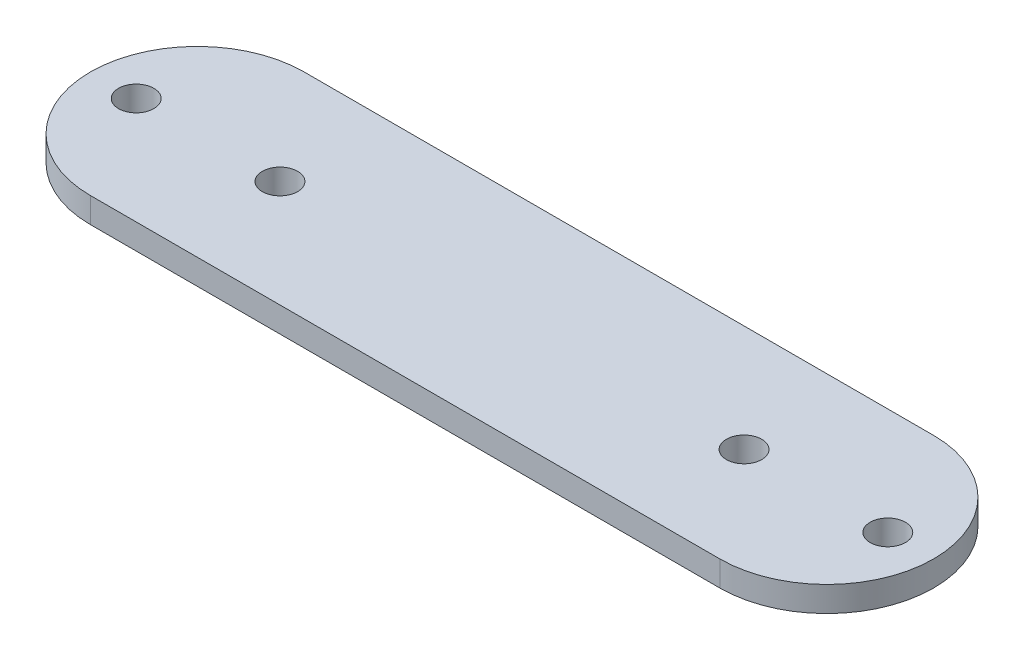
ISO-10303-21;
HEADER;
FILE_DESCRIPTION(('STEP AP214'),'2;1');
FILE_NAME('part.step','',(''),(''),'','','');
FILE_SCHEMA(('AUTOMOTIVE_DESIGN { 1 0 10303 214 1 1 1 1 }'));
ENDSEC;
DATA;
#1=APPLICATION_CONTEXT('core data for automotive mechanical design processes');
#2=APPLICATION_PROTOCOL_DEFINITION('international standard','automotive_design',2000,#1);
#3=PRODUCT_CONTEXT('',#1,'mechanical');
#4=PRODUCT('Part','Part','',(#3));
#5=PRODUCT_RELATED_PRODUCT_CATEGORY('part','',(#4));
#6=PRODUCT_DEFINITION_FORMATION('','',#4);
#7=PRODUCT_DEFINITION_CONTEXT('part definition',#1,'design');
#8=PRODUCT_DEFINITION('design','',#6,#7);
#9=PRODUCT_DEFINITION_SHAPE('','',#8);
#10=(LENGTH_UNIT() NAMED_UNIT(*) SI_UNIT(.MILLI.,.METRE.));
#11=(NAMED_UNIT(*) PLANE_ANGLE_UNIT() SI_UNIT($,.RADIAN.));
#12=(NAMED_UNIT(*) SI_UNIT($,.STERADIAN.) SOLID_ANGLE_UNIT());
#13=UNCERTAINTY_MEASURE_WITH_UNIT(LENGTH_MEASURE(1.E-05),#10,'distance_accuracy_value','');
#14=(GEOMETRIC_REPRESENTATION_CONTEXT(3) GLOBAL_UNCERTAINTY_ASSIGNED_CONTEXT((#13)) GLOBAL_UNIT_ASSIGNED_CONTEXT((#10,
#11,#12)) REPRESENTATION_CONTEXT('',''));
#15=CARTESIAN_POINT('',(0.,0.,0.));
#16=DIRECTION('',(0.,0.,1.));
#17=DIRECTION('',(1.,0.,0.));
#18=AXIS2_PLACEMENT_3D('',#15,#16,#17);
#19=CARTESIAN_POINT('',(-31.2,2.5,0.));
#20=DIRECTION('',(0.,-1.,0.));
#21=DIRECTION('',(0.,0.,-1.));
#22=AXIS2_PLACEMENT_3D('',#19,#20,#21);
#23=CYLINDRICAL_SURFACE('',#22,10.6);
#24=CARTESIAN_POINT('',(-31.2,0.,0.));
#25=DIRECTION('',(0.,1.,0.));
#26=DIRECTION('',(0.,0.,1.));
#27=AXIS2_PLACEMENT_3D('',#24,#25,#26);
#28=CIRCLE('',#27,10.6);
#29=CARTESIAN_POINT('',(-31.2,0.,-10.6));
#30=VERTEX_POINT('',#29);
#31=CARTESIAN_POINT('',(-31.2,0.,10.6));
#32=VERTEX_POINT('',#31);
#33=EDGE_CURVE('E104',#30,#32,#28,.T.);
#34=ORIENTED_EDGE('',*,*,#33,.T.);
#35=DIRECTION('',(0.,-1.,0.));
#36=VECTOR('',#35,1.);
#37=CARTESIAN_POINT('',(-31.2,2.5,10.6));
#38=LINE('',#37,#36);
#39=CARTESIAN_POINT('',(-31.2,2.5,10.6));
#40=VERTEX_POINT('',#39);
#41=EDGE_CURVE('E11',#40,#32,#38,.T.);
#42=ORIENTED_EDGE('',*,*,#41,.F.);
#43=CARTESIAN_POINT('',(-31.2,2.5,0.));
#44=DIRECTION('',(0.,1.,0.));
#45=DIRECTION('',(0.,0.,1.));
#46=AXIS2_PLACEMENT_3D('',#43,#44,#45);
#47=CIRCLE('',#46,10.6);
#48=CARTESIAN_POINT('',(-31.2,2.5,-10.6));
#49=VERTEX_POINT('',#48);
#50=EDGE_CURVE('E92',#49,#40,#47,.T.);
#51=ORIENTED_EDGE('',*,*,#50,.F.);
#52=DIRECTION('',(0.,-1.,0.));
#53=VECTOR('',#52,1.);
#54=CARTESIAN_POINT('',(-31.2,2.5,-10.6));
#55=LINE('',#54,#53);
#56=EDGE_CURVE('E100',#49,#30,#55,.T.);
#57=ORIENTED_EDGE('',*,*,#56,.T.);
#58=EDGE_LOOP('',(#34,#42,#51,#57));
#59=FACE_BOUND('',#58,.T.);
#60=ADVANCED_FACE('F41',(#59),#23,.T.);
#61=CARTESIAN_POINT('',(-31.2,2.5,10.6));
#62=DIRECTION('',(0.,0.,-1.));
#63=DIRECTION('',(-1.,0.,0.));
#64=AXIS2_PLACEMENT_3D('',#61,#62,#63);
#65=PLANE('',#64);
#66=DIRECTION('',(1.,0.,0.));
#67=VECTOR('',#66,1.);
#68=CARTESIAN_POINT('',(-31.2,0.,10.6));
#69=LINE('',#68,#67);
#70=CARTESIAN_POINT('',(31.2,0.,10.6));
#71=VERTEX_POINT('',#70);
#72=EDGE_CURVE('E96',#32,#71,#69,.T.);
#73=ORIENTED_EDGE('',*,*,#72,.T.);
#74=DIRECTION('',(0.,-1.,0.));
#75=VECTOR('',#74,1.);
#76=CARTESIAN_POINT('',(31.2,2.5,10.6));
#77=LINE('',#76,#75);
#78=CARTESIAN_POINT('',(31.2,2.5,10.6));
#79=VERTEX_POINT('',#78);
#80=EDGE_CURVE('E49',#79,#71,#77,.T.);
#81=ORIENTED_EDGE('',*,*,#80,.F.);
#82=DIRECTION('',(1.,0.,0.));
#83=VECTOR('',#82,1.);
#84=CARTESIAN_POINT('',(-31.2,2.5,10.6));
#85=LINE('',#84,#83);
#86=EDGE_CURVE('E87',#40,#79,#85,.T.);
#87=ORIENTED_EDGE('',*,*,#86,.F.);
#88=ORIENTED_EDGE('',*,*,#41,.T.);
#89=EDGE_LOOP('',(#73,#81,#87,#88));
#90=FACE_BOUND('',#89,.T.);
#91=ADVANCED_FACE('F95',(#90),#65,.F.);
#92=CARTESIAN_POINT('',(31.2,2.5,0.));
#93=DIRECTION('',(0.,-1.,0.));
#94=DIRECTION('',(0.,0.,-1.));
#95=AXIS2_PLACEMENT_3D('',#92,#93,#94);
#96=CYLINDRICAL_SURFACE('',#95,10.6);
#97=CARTESIAN_POINT('',(31.2,0.,0.));
#98=DIRECTION('',(0.,1.,0.));
#99=DIRECTION('',(0.,0.,1.));
#100=AXIS2_PLACEMENT_3D('',#97,#98,#99);
#101=CIRCLE('',#100,10.6);
#102=CARTESIAN_POINT('',(31.2,0.,-10.6));
#103=VERTEX_POINT('',#102);
#104=EDGE_CURVE('E74',#71,#103,#101,.T.);
#105=ORIENTED_EDGE('',*,*,#104,.T.);
#106=DIRECTION('',(0.,-1.,0.));
#107=VECTOR('',#106,1.);
#108=CARTESIAN_POINT('',(31.2,2.5,-10.6));
#109=LINE('',#108,#107);
#110=CARTESIAN_POINT('',(31.2,2.5,-10.6));
#111=VERTEX_POINT('',#110);
#112=EDGE_CURVE('E97',#111,#103,#109,.T.);
#113=ORIENTED_EDGE('',*,*,#112,.F.);
#114=CARTESIAN_POINT('',(31.2,2.5,0.));
#115=DIRECTION('',(0.,1.,0.));
#116=DIRECTION('',(0.,0.,1.));
#117=AXIS2_PLACEMENT_3D('',#114,#115,#116);
#118=CIRCLE('',#117,10.6);
#119=EDGE_CURVE('E90',#79,#111,#118,.T.);
#120=ORIENTED_EDGE('',*,*,#119,.F.);
#121=ORIENTED_EDGE('',*,*,#80,.T.);
#122=EDGE_LOOP('',(#105,#113,#120,#121));
#123=FACE_BOUND('',#122,.T.);
#124=ADVANCED_FACE('F98',(#123),#96,.T.);
#125=CARTESIAN_POINT('',(-31.2,2.5,-10.6));
#126=DIRECTION('',(0.,0.,1.));
#127=DIRECTION('',(1.,0.,0.));
#128=AXIS2_PLACEMENT_3D('',#125,#126,#127);
#129=PLANE('',#128);
#130=DIRECTION('',(-1.,0.,0.));
#131=VECTOR('',#130,1.);
#132=CARTESIAN_POINT('',(-31.2,0.,-10.6));
#133=LINE('',#132,#131);
#134=EDGE_CURVE('E80',#103,#30,#133,.T.);
#135=ORIENTED_EDGE('',*,*,#134,.T.);
#136=ORIENTED_EDGE('',*,*,#56,.F.);
#137=DIRECTION('',(-1.,0.,0.));
#138=VECTOR('',#137,1.);
#139=CARTESIAN_POINT('',(-31.2,2.5,-10.6));
#140=LINE('',#139,#138);
#141=EDGE_CURVE('E57',#111,#49,#140,.T.);
#142=ORIENTED_EDGE('',*,*,#141,.F.);
#143=ORIENTED_EDGE('',*,*,#112,.T.);
#144=EDGE_LOOP('',(#135,#136,#142,#143));
#145=FACE_BOUND('',#144,.T.);
#146=ADVANCED_FACE('F112',(#145),#129,.F.);
#147=CARTESIAN_POINT('',(-31.2,2.5,0.));
#148=DIRECTION('',(0.,1.,0.));
#149=DIRECTION('',(0.,0.,1.));
#150=AXIS2_PLACEMENT_3D('',#147,#148,#149);
#151=PLANE('',#150);
#152=CARTESIAN_POINT('',(-37.25,2.5,0.));
#153=DIRECTION('',(0.,1.,0.));
#154=DIRECTION('',(0.,0.,1.));
#155=AXIS2_PLACEMENT_3D('',#152,#153,#154);
#156=CIRCLE('',#155,1.75);
#157=CARTESIAN_POINT('',(-37.25,2.5,1.75));
#158=VERTEX_POINT('',#157);
#159=EDGE_CURVE('E136',#158,#158,#156,.T.);
#160=ORIENTED_EDGE('',*,*,#159,.F.);
#161=EDGE_LOOP('',(#160));
#162=FACE_BOUND('',#161,.T.);
#163=CARTESIAN_POINT('',(-23.,2.5,0.));
#164=DIRECTION('',(0.,1.,0.));
#165=DIRECTION('',(0.,0.,1.));
#166=AXIS2_PLACEMENT_3D('',#163,#164,#165);
#167=CIRCLE('',#166,1.75);
#168=CARTESIAN_POINT('',(-23.,2.5,1.75));
#169=VERTEX_POINT('',#168);
#170=EDGE_CURVE('E133',#169,#169,#167,.T.);
#171=ORIENTED_EDGE('',*,*,#170,.F.);
#172=EDGE_LOOP('',(#171));
#173=FACE_BOUND('',#172,.T.);
#174=CARTESIAN_POINT('',(23.,2.5,0.));
#175=DIRECTION('',(0.,1.,0.));
#176=DIRECTION('',(0.,0.,1.));
#177=AXIS2_PLACEMENT_3D('',#174,#175,#176);
#178=CIRCLE('',#177,1.75);
#179=CARTESIAN_POINT('',(23.,2.5,1.75));
#180=VERTEX_POINT('',#179);
#181=EDGE_CURVE('E127',#180,#180,#178,.T.);
#182=ORIENTED_EDGE('',*,*,#181,.F.);
#183=EDGE_LOOP('',(#182));
#184=FACE_BOUND('',#183,.T.);
#185=CARTESIAN_POINT('',(37.25,2.5,0.));
#186=DIRECTION('',(0.,1.,0.));
#187=DIRECTION('',(0.,0.,1.));
#188=AXIS2_PLACEMENT_3D('',#185,#186,#187);
#189=CIRCLE('',#188,1.75);
#190=CARTESIAN_POINT('',(37.25,2.5,1.75));
#191=VERTEX_POINT('',#190);
#192=EDGE_CURVE('E121',#191,#191,#189,.T.);
#193=ORIENTED_EDGE('',*,*,#192,.F.);
#194=EDGE_LOOP('',(#193));
#195=FACE_BOUND('',#194,.T.);
#196=ORIENTED_EDGE('',*,*,#50,.T.);
#197=ORIENTED_EDGE('',*,*,#86,.T.);
#198=ORIENTED_EDGE('',*,*,#119,.T.);
#199=ORIENTED_EDGE('',*,*,#141,.T.);
#200=EDGE_LOOP('',(#196,#197,#198,#199));
#201=FACE_BOUND('',#200,.T.);
#202=ADVANCED_FACE('F88',(#162,#173,#184,#195,#201),#151,.T.);
#203=CARTESIAN_POINT('',(-31.2,0.,0.));
#204=DIRECTION('',(0.,1.,0.));
#205=DIRECTION('',(0.,0.,1.));
#206=AXIS2_PLACEMENT_3D('',#203,#204,#205);
#207=PLANE('',#206);
#208=CARTESIAN_POINT('',(-37.25,0.,0.));
#209=DIRECTION('',(0.,1.,0.));
#210=DIRECTION('',(0.,0.,1.));
#211=AXIS2_PLACEMENT_3D('',#208,#209,#210);
#212=CIRCLE('',#211,1.75);
#213=CARTESIAN_POINT('',(-37.25,0.,1.75));
#214=VERTEX_POINT('',#213);
#215=EDGE_CURVE('E107',#214,#214,#212,.T.);
#216=ORIENTED_EDGE('',*,*,#215,.T.);
#217=EDGE_LOOP('',(#216));
#218=FACE_BOUND('',#217,.T.);
#219=CARTESIAN_POINT('',(-23.,0.,0.));
#220=DIRECTION('',(0.,1.,0.));
#221=DIRECTION('',(0.,0.,1.));
#222=AXIS2_PLACEMENT_3D('',#219,#220,#221);
#223=CIRCLE('',#222,1.75);
#224=CARTESIAN_POINT('',(-23.,0.,1.75));
#225=VERTEX_POINT('',#224);
#226=EDGE_CURVE('E130',#225,#225,#223,.T.);
#227=ORIENTED_EDGE('',*,*,#226,.T.);
#228=EDGE_LOOP('',(#227));
#229=FACE_BOUND('',#228,.T.);
#230=CARTESIAN_POINT('',(23.,0.,0.));
#231=DIRECTION('',(0.,1.,0.));
#232=DIRECTION('',(0.,0.,1.));
#233=AXIS2_PLACEMENT_3D('',#230,#231,#232);
#234=CIRCLE('',#233,1.75);
#235=CARTESIAN_POINT('',(23.,0.,1.75));
#236=VERTEX_POINT('',#235);
#237=EDGE_CURVE('E124',#236,#236,#234,.T.);
#238=ORIENTED_EDGE('',*,*,#237,.T.);
#239=EDGE_LOOP('',(#238));
#240=FACE_BOUND('',#239,.T.);
#241=CARTESIAN_POINT('',(37.25,0.,0.));
#242=DIRECTION('',(0.,1.,0.));
#243=DIRECTION('',(0.,0.,1.));
#244=AXIS2_PLACEMENT_3D('',#241,#242,#243);
#245=CIRCLE('',#244,1.75);
#246=CARTESIAN_POINT('',(37.25,0.,1.75));
#247=VERTEX_POINT('',#246);
#248=EDGE_CURVE('E118',#247,#247,#245,.T.);
#249=ORIENTED_EDGE('',*,*,#248,.T.);
#250=EDGE_LOOP('',(#249));
#251=FACE_BOUND('',#250,.T.);
#252=ORIENTED_EDGE('',*,*,#33,.F.);
#253=ORIENTED_EDGE('',*,*,#134,.F.);
#254=ORIENTED_EDGE('',*,*,#104,.F.);
#255=ORIENTED_EDGE('',*,*,#72,.F.);
#256=EDGE_LOOP('',(#252,#253,#254,#255));
#257=FACE_BOUND('',#256,.T.);
#258=ADVANCED_FACE('F115',(#218,#229,#240,#251,#257),#207,.F.);
#259=CARTESIAN_POINT('',(37.25,0.,0.));
#260=DIRECTION('',(0.,1.,0.));
#261=DIRECTION('',(0.,0.,1.));
#262=AXIS2_PLACEMENT_3D('',#259,#260,#261);
#263=CYLINDRICAL_SURFACE('',#262,1.75);
#264=ORIENTED_EDGE('',*,*,#248,.F.);
#265=EDGE_LOOP('',(#264));
#266=FACE_BOUND('',#265,.T.);
#267=ORIENTED_EDGE('',*,*,#192,.T.);
#268=EDGE_LOOP('',(#267));
#269=FACE_BOUND('',#268,.T.);
#270=ADVANCED_FACE('F160',(#266,#269),#263,.F.);
#271=CARTESIAN_POINT('',(23.,0.,0.));
#272=DIRECTION('',(0.,1.,0.));
#273=DIRECTION('',(0.,0.,1.));
#274=AXIS2_PLACEMENT_3D('',#271,#272,#273);
#275=CYLINDRICAL_SURFACE('',#274,1.75);
#276=ORIENTED_EDGE('',*,*,#237,.F.);
#277=EDGE_LOOP('',(#276));
#278=FACE_BOUND('',#277,.T.);
#279=ORIENTED_EDGE('',*,*,#181,.T.);
#280=EDGE_LOOP('',(#279));
#281=FACE_BOUND('',#280,.T.);
#282=ADVANCED_FACE('F162',(#278,#281),#275,.F.);
#283=CARTESIAN_POINT('',(-23.,0.,0.));
#284=DIRECTION('',(0.,1.,0.));
#285=DIRECTION('',(0.,0.,1.));
#286=AXIS2_PLACEMENT_3D('',#283,#284,#285);
#287=CYLINDRICAL_SURFACE('',#286,1.75);
#288=ORIENTED_EDGE('',*,*,#226,.F.);
#289=EDGE_LOOP('',(#288));
#290=FACE_BOUND('',#289,.T.);
#291=ORIENTED_EDGE('',*,*,#170,.T.);
#292=EDGE_LOOP('',(#291));
#293=FACE_BOUND('',#292,.T.);
#294=ADVANCED_FACE('F147',(#290,#293),#287,.F.);
#295=CARTESIAN_POINT('',(-37.25,0.,0.));
#296=DIRECTION('',(0.,1.,0.));
#297=DIRECTION('',(0.,0.,1.));
#298=AXIS2_PLACEMENT_3D('',#295,#296,#297);
#299=CYLINDRICAL_SURFACE('',#298,1.75);
#300=ORIENTED_EDGE('',*,*,#215,.F.);
#301=EDGE_LOOP('',(#300));
#302=FACE_BOUND('',#301,.T.);
#303=ORIENTED_EDGE('',*,*,#159,.T.);
#304=EDGE_LOOP('',(#303));
#305=FACE_BOUND('',#304,.T.);
#306=ADVANCED_FACE('F144',(#302,#305),#299,.F.);
#307=CLOSED_SHELL('',(#60,#91,#124,#146,#202,#258,#270,#282,#294,#306));
#308=MANIFOLD_SOLID_BREP('B2',#307);
#309=ADVANCED_BREP_SHAPE_REPRESENTATION('',(#18,#308),#14);
#310=SHAPE_DEFINITION_REPRESENTATION(#9,#309);
ENDSEC;
END-ISO-10303-21;
